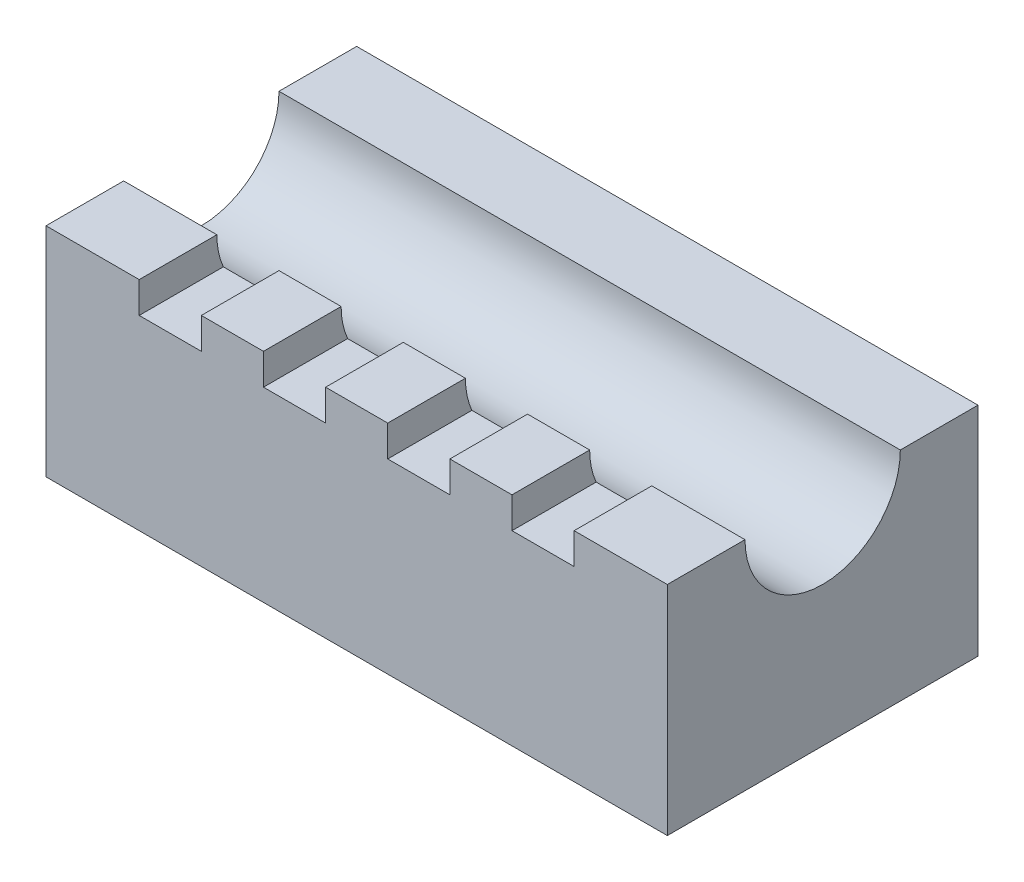
ISO-10303-21;
HEADER;
FILE_DESCRIPTION(('STEP AP214'),'2;1');
FILE_NAME('part.step','',(''),(''),'','','');
FILE_SCHEMA(('AUTOMOTIVE_DESIGN { 1 0 10303 214 1 1 1 1 }'));
ENDSEC;
DATA;
#1=APPLICATION_CONTEXT('core data for automotive mechanical design processes');
#2=APPLICATION_PROTOCOL_DEFINITION('international standard','automotive_design',2000,#1);
#3=PRODUCT_CONTEXT('',#1,'mechanical');
#4=PRODUCT('Part','Part','',(#3));
#5=PRODUCT_RELATED_PRODUCT_CATEGORY('part','',(#4));
#6=PRODUCT_DEFINITION_FORMATION('','',#4);
#7=PRODUCT_DEFINITION_CONTEXT('part definition',#1,'design');
#8=PRODUCT_DEFINITION('design','',#6,#7);
#9=PRODUCT_DEFINITION_SHAPE('','',#8);
#10=(LENGTH_UNIT() NAMED_UNIT(*) SI_UNIT(.MILLI.,.METRE.));
#11=(NAMED_UNIT(*) PLANE_ANGLE_UNIT() SI_UNIT($,.RADIAN.));
#12=(NAMED_UNIT(*) SI_UNIT($,.STERADIAN.) SOLID_ANGLE_UNIT());
#13=UNCERTAINTY_MEASURE_WITH_UNIT(LENGTH_MEASURE(1.E-05),#10,'distance_accuracy_value','');
#14=(GEOMETRIC_REPRESENTATION_CONTEXT(3) GLOBAL_UNCERTAINTY_ASSIGNED_CONTEXT((#13)) GLOBAL_UNIT_ASSIGNED_CONTEXT((#10,
#11,#12)) REPRESENTATION_CONTEXT('',''));
#15=CARTESIAN_POINT('',(0.,0.,0.));
#16=DIRECTION('',(0.,0.,1.));
#17=DIRECTION('',(1.,0.,0.));
#18=AXIS2_PLACEMENT_3D('',#15,#16,#17);
#19=CARTESIAN_POINT('',(0.,35.,0.));
#20=DIRECTION('',(0.,0.,-1.));
#21=DIRECTION('',(-1.,0.,0.));
#22=AXIS2_PLACEMENT_3D('',#19,#20,#21);
#23=PLANE('',#22);
#24=DIRECTION('',(0.,-1.,0.));
#25=VECTOR('',#24,1.);
#26=CARTESIAN_POINT('',(25.,0.,0.));
#27=LINE('',#26,#25);
#28=CARTESIAN_POINT('',(25.,35.,0.));
#29=VERTEX_POINT('',#28);
#30=CARTESIAN_POINT('',(25.,30.,0.));
#31=VERTEX_POINT('',#30);
#32=EDGE_CURVE('E187',#29,#31,#27,.T.);
#33=ORIENTED_EDGE('',*,*,#32,.T.);
#34=DIRECTION('',(1.,0.,0.));
#35=VECTOR('',#34,1.);
#36=CARTESIAN_POINT('',(0.,30.,0.));
#37=LINE('',#36,#35);
#38=CARTESIAN_POINT('',(15.,30.,0.));
#39=VERTEX_POINT('',#38);
#40=EDGE_CURVE('E212',#39,#31,#37,.T.);
#41=ORIENTED_EDGE('',*,*,#40,.F.);
#42=DIRECTION('',(0.,-1.,0.));
#43=VECTOR('',#42,1.);
#44=CARTESIAN_POINT('',(15.,0.,0.));
#45=LINE('',#44,#43);
#46=CARTESIAN_POINT('',(15.,35.,0.));
#47=VERTEX_POINT('',#46);
#48=EDGE_CURVE('E199',#47,#39,#45,.T.);
#49=ORIENTED_EDGE('',*,*,#48,.F.);
#50=DIRECTION('',(1.,0.,0.));
#51=VECTOR('',#50,1.);
#52=CARTESIAN_POINT('',(0.,35.,0.));
#53=LINE('',#52,#51);
#54=CARTESIAN_POINT('',(0.,35.,0.));
#55=VERTEX_POINT('',#54);
#56=EDGE_CURVE('E218',#55,#47,#53,.T.);
#57=ORIENTED_EDGE('',*,*,#56,.F.);
#58=DIRECTION('',(0.,-1.,0.));
#59=VECTOR('',#58,1.);
#60=CARTESIAN_POINT('',(0.,35.,0.));
#61=LINE('',#60,#59);
#62=CARTESIAN_POINT('',(0.,0.,0.));
#63=VERTEX_POINT('',#62);
#64=EDGE_CURVE('E266',#55,#63,#61,.T.);
#65=ORIENTED_EDGE('',*,*,#64,.T.);
#66=DIRECTION('',(1.,0.,0.));
#67=VECTOR('',#66,1.);
#68=CARTESIAN_POINT('',(0.,0.,0.));
#69=LINE('',#68,#67);
#70=CARTESIAN_POINT('',(100.,0.,0.));
#71=VERTEX_POINT('',#70);
#72=EDGE_CURVE('E244',#63,#71,#69,.T.);
#73=ORIENTED_EDGE('',*,*,#72,.T.);
#74=DIRECTION('',(0.,-1.,0.));
#75=VECTOR('',#74,1.);
#76=CARTESIAN_POINT('',(100.,35.,0.));
#77=LINE('',#76,#75);
#78=CARTESIAN_POINT('',(100.,35.,0.));
#79=VERTEX_POINT('',#78);
#80=EDGE_CURVE('E262',#79,#71,#77,.T.);
#81=ORIENTED_EDGE('',*,*,#80,.F.);
#82=CARTESIAN_POINT('',(85.,35.,0.));
#83=VERTEX_POINT('',#82);
#84=EDGE_CURVE('E225',#83,#79,#53,.T.);
#85=ORIENTED_EDGE('',*,*,#84,.F.);
#86=DIRECTION('',(0.,-1.,0.));
#87=VECTOR('',#86,1.);
#88=CARTESIAN_POINT('',(85.,0.,0.));
#89=LINE('',#88,#87);
#90=CARTESIAN_POINT('',(85.,30.,0.));
#91=VERTEX_POINT('',#90);
#92=EDGE_CURVE('E381',#83,#91,#89,.T.);
#93=ORIENTED_EDGE('',*,*,#92,.T.);
#94=DIRECTION('',(1.,0.,0.));
#95=VECTOR('',#94,1.);
#96=CARTESIAN_POINT('',(0.,30.,0.));
#97=LINE('',#96,#95);
#98=CARTESIAN_POINT('',(75.,30.,0.));
#99=VERTEX_POINT('',#98);
#100=EDGE_CURVE('E389',#99,#91,#97,.T.);
#101=ORIENTED_EDGE('',*,*,#100,.F.);
#102=DIRECTION('',(0.,-1.,0.));
#103=VECTOR('',#102,1.);
#104=CARTESIAN_POINT('',(75.,0.,0.));
#105=LINE('',#104,#103);
#106=CARTESIAN_POINT('',(75.,35.,0.));
#107=VERTEX_POINT('',#106);
#108=EDGE_CURVE('E385',#107,#99,#105,.T.);
#109=ORIENTED_EDGE('',*,*,#108,.F.);
#110=CARTESIAN_POINT('',(65.,35.,0.));
#111=VERTEX_POINT('',#110);
#112=EDGE_CURVE('E227',#111,#107,#53,.T.);
#113=ORIENTED_EDGE('',*,*,#112,.F.);
#114=DIRECTION('',(0.,-1.,0.));
#115=VECTOR('',#114,1.);
#116=CARTESIAN_POINT('',(65.,0.,0.));
#117=LINE('',#116,#115);
#118=CARTESIAN_POINT('',(65.,30.,0.));
#119=VERTEX_POINT('',#118);
#120=EDGE_CURVE('E356',#111,#119,#117,.T.);
#121=ORIENTED_EDGE('',*,*,#120,.T.);
#122=DIRECTION('',(1.,0.,0.));
#123=VECTOR('',#122,1.);
#124=CARTESIAN_POINT('',(0.,30.,0.));
#125=LINE('',#124,#123);
#126=CARTESIAN_POINT('',(55.,30.,0.));
#127=VERTEX_POINT('',#126);
#128=EDGE_CURVE('E365',#127,#119,#125,.T.);
#129=ORIENTED_EDGE('',*,*,#128,.F.);
#130=DIRECTION('',(0.,-1.,0.));
#131=VECTOR('',#130,1.);
#132=CARTESIAN_POINT('',(55.,0.,0.));
#133=LINE('',#132,#131);
#134=CARTESIAN_POINT('',(55.,35.,0.));
#135=VERTEX_POINT('',#134);
#136=EDGE_CURVE('E360',#135,#127,#133,.T.);
#137=ORIENTED_EDGE('',*,*,#136,.F.);
#138=CARTESIAN_POINT('',(45.,35.,0.));
#139=VERTEX_POINT('',#138);
#140=EDGE_CURVE('E219',#139,#135,#53,.T.);
#141=ORIENTED_EDGE('',*,*,#140,.F.);
#142=DIRECTION('',(0.,-1.,0.));
#143=VECTOR('',#142,1.);
#144=CARTESIAN_POINT('',(45.,0.,0.));
#145=LINE('',#144,#143);
#146=CARTESIAN_POINT('',(45.,30.,0.));
#147=VERTEX_POINT('',#146);
#148=EDGE_CURVE('E334',#139,#147,#145,.T.);
#149=ORIENTED_EDGE('',*,*,#148,.T.);
#150=DIRECTION('',(1.,0.,0.));
#151=VECTOR('',#150,1.);
#152=CARTESIAN_POINT('',(0.,30.,0.));
#153=LINE('',#152,#151);
#154=CARTESIAN_POINT('',(35.,30.,0.));
#155=VERTEX_POINT('',#154);
#156=EDGE_CURVE('E341',#155,#147,#153,.T.);
#157=ORIENTED_EDGE('',*,*,#156,.F.);
#158=DIRECTION('',(0.,-1.,0.));
#159=VECTOR('',#158,1.);
#160=CARTESIAN_POINT('',(35.,0.,0.));
#161=LINE('',#160,#159);
#162=CARTESIAN_POINT('',(35.,35.,0.));
#163=VERTEX_POINT('',#162);
#164=EDGE_CURVE('E216',#163,#155,#161,.T.);
#165=ORIENTED_EDGE('',*,*,#164,.F.);
#166=EDGE_CURVE('E207',#29,#163,#53,.T.);
#167=ORIENTED_EDGE('',*,*,#166,.F.);
#168=EDGE_LOOP('',(#33,#41,#49,#57,#65,#73,#81,#85,#93,#101,#109,#113,#121,#129,#137,#141,#149,
#157,#165,#167));
#169=FACE_BOUND('',#168,.T.);
#170=ADVANCED_FACE('F39',(#169),#23,.F.);
#171=CARTESIAN_POINT('',(0.,35.,0.));
#172=DIRECTION('',(0.,-1.,0.));
#173=DIRECTION('',(0.,0.,-1.));
#174=AXIS2_PLACEMENT_3D('',#171,#172,#173);
#175=PLANE('',#174);
#176=DIRECTION('',(0.,0.,1.));
#177=VECTOR('',#176,1.);
#178=CARTESIAN_POINT('',(25.,35.,-25.));
#179=LINE('',#178,#177);
#180=CARTESIAN_POINT('',(25.,35.,-12.5));
#181=VERTEX_POINT('',#180);
#182=EDGE_CURVE('E190',#181,#29,#179,.T.);
#183=ORIENTED_EDGE('',*,*,#182,.T.);
#184=ORIENTED_EDGE('',*,*,#166,.T.);
#185=DIRECTION('',(0.,0.,1.));
#186=VECTOR('',#185,1.);
#187=CARTESIAN_POINT('',(35.,35.,-25.));
#188=LINE('',#187,#186);
#189=CARTESIAN_POINT('',(35.,35.,-12.5));
#190=VERTEX_POINT('',#189);
#191=EDGE_CURVE('E350',#190,#163,#188,.T.);
#192=ORIENTED_EDGE('',*,*,#191,.F.);
#193=DIRECTION('',(1.,0.,0.));
#194=VECTOR('',#193,1.);
#195=CARTESIAN_POINT('',(0.,35.,-12.5));
#196=LINE('',#195,#194);
#197=EDGE_CURVE('E209',#190,#181,#196,.F.);
#198=ORIENTED_EDGE('',*,*,#197,.T.);
#199=EDGE_LOOP('',(#183,#184,#192,#198));
#200=FACE_BOUND('',#199,.T.);
#201=ADVANCED_FACE('F205',(#200),#175,.F.);
#202=DIRECTION('',(0.,0.,1.));
#203=VECTOR('',#202,1.);
#204=CARTESIAN_POINT('',(45.,35.,-25.));
#205=LINE('',#204,#203);
#206=CARTESIAN_POINT('',(45.,35.,-12.5));
#207=VERTEX_POINT('',#206);
#208=EDGE_CURVE('E345',#207,#139,#205,.T.);
#209=ORIENTED_EDGE('',*,*,#208,.T.);
#210=ORIENTED_EDGE('',*,*,#140,.T.);
#211=DIRECTION('',(0.,0.,1.));
#212=VECTOR('',#211,1.);
#213=CARTESIAN_POINT('',(55.,35.,-25.));
#214=LINE('',#213,#212);
#215=CARTESIAN_POINT('',(55.,35.,-12.5));
#216=VERTEX_POINT('',#215);
#217=EDGE_CURVE('E375',#216,#135,#214,.T.);
#218=ORIENTED_EDGE('',*,*,#217,.F.);
#219=EDGE_CURVE('E475',#216,#207,#196,.F.);
#220=ORIENTED_EDGE('',*,*,#219,.T.);
#221=EDGE_LOOP('',(#209,#210,#218,#220));
#222=FACE_BOUND('',#221,.T.);
#223=ADVANCED_FACE('F473',(#222),#175,.F.);
#224=DIRECTION('',(0.,0.,1.));
#225=VECTOR('',#224,1.);
#226=CARTESIAN_POINT('',(65.,35.,-25.));
#227=LINE('',#226,#225);
#228=CARTESIAN_POINT('',(65.,35.,-12.5));
#229=VERTEX_POINT('',#228);
#230=EDGE_CURVE('E369',#229,#111,#227,.T.);
#231=ORIENTED_EDGE('',*,*,#230,.T.);
#232=ORIENTED_EDGE('',*,*,#112,.T.);
#233=DIRECTION('',(0.,0.,1.));
#234=VECTOR('',#233,1.);
#235=CARTESIAN_POINT('',(75.,35.,-25.));
#236=LINE('',#235,#234);
#237=CARTESIAN_POINT('',(75.,35.,-12.5));
#238=VERTEX_POINT('',#237);
#239=EDGE_CURVE('E399',#238,#107,#236,.T.);
#240=ORIENTED_EDGE('',*,*,#239,.F.);
#241=EDGE_CURVE('E276',#238,#229,#196,.F.);
#242=ORIENTED_EDGE('',*,*,#241,.T.);
#243=EDGE_LOOP('',(#231,#232,#240,#242));
#244=FACE_BOUND('',#243,.T.);
#245=ADVANCED_FACE('F455',(#244),#175,.F.);
#246=DIRECTION('',(0.,0.,1.));
#247=VECTOR('',#246,1.);
#248=CARTESIAN_POINT('',(85.,35.,-25.));
#249=LINE('',#248,#247);
#250=CARTESIAN_POINT('',(85.,35.,-12.5));
#251=VERTEX_POINT('',#250);
#252=EDGE_CURVE('E393',#251,#83,#249,.T.);
#253=ORIENTED_EDGE('',*,*,#252,.T.);
#254=ORIENTED_EDGE('',*,*,#84,.T.);
#255=DIRECTION('',(0.,0.,-1.));
#256=VECTOR('',#255,1.);
#257=CARTESIAN_POINT('',(100.,35.,0.));
#258=LINE('',#257,#256);
#259=CARTESIAN_POINT('',(100.,35.,-12.5));
#260=VERTEX_POINT('',#259);
#261=EDGE_CURVE('E232',#79,#260,#258,.T.);
#262=ORIENTED_EDGE('',*,*,#261,.T.);
#263=EDGE_CURVE('E271',#260,#251,#196,.F.);
#264=ORIENTED_EDGE('',*,*,#263,.T.);
#265=EDGE_LOOP('',(#253,#254,#262,#264));
#266=FACE_BOUND('',#265,.T.);
#267=ADVANCED_FACE('F439',(#266),#175,.F.);
#268=CARTESIAN_POINT('',(0.,35.,-25.));
#269=DIRECTION('',(1.,0.,0.));
#270=DIRECTION('',(0.,0.,-1.));
#271=AXIS2_PLACEMENT_3D('',#268,#269,#270);
#272=CYLINDRICAL_SURFACE('',#271,12.5);
#273=CARTESIAN_POINT('',(25.,35.,-25.));
#274=DIRECTION('',(-1.,0.,0.));
#275=DIRECTION('',(0.,0.,1.));
#276=AXIS2_PLACEMENT_3D('',#273,#274,#275);
#277=CIRCLE('',#276,12.5);
#278=CARTESIAN_POINT('',(25.,30.,-13.5435607626104));
#279=VERTEX_POINT('',#278);
#280=EDGE_CURVE('E11',#181,#279,#277,.F.);
#281=ORIENTED_EDGE('',*,*,#280,.F.);
#282=ORIENTED_EDGE('',*,*,#197,.F.);
#283=CARTESIAN_POINT('',(35.,35.,-25.));
#284=DIRECTION('',(-1.,0.,0.));
#285=DIRECTION('',(0.,0.,1.));
#286=AXIS2_PLACEMENT_3D('',#283,#284,#285);
#287=CIRCLE('',#286,12.5);
#288=CARTESIAN_POINT('',(35.,30.,-13.5435607626104));
#289=VERTEX_POINT('',#288);
#290=EDGE_CURVE('E302',#190,#289,#287,.F.);
#291=ORIENTED_EDGE('',*,*,#290,.T.);
#292=DIRECTION('',(1.,0.,0.));
#293=VECTOR('',#292,1.);
#294=CARTESIAN_POINT('',(0.,30.,-13.5435607626104));
#295=LINE('',#294,#293);
#296=CARTESIAN_POINT('',(45.,30.,-13.5435607626104));
#297=VERTEX_POINT('',#296);
#298=EDGE_CURVE('E306',#289,#297,#295,.T.);
#299=ORIENTED_EDGE('',*,*,#298,.T.);
#300=CARTESIAN_POINT('',(45.,35.,-25.));
#301=DIRECTION('',(-1.,0.,0.));
#302=DIRECTION('',(0.,0.,1.));
#303=AXIS2_PLACEMENT_3D('',#300,#301,#302);
#304=CIRCLE('',#303,12.5);
#305=EDGE_CURVE('E310',#207,#297,#304,.F.);
#306=ORIENTED_EDGE('',*,*,#305,.F.);
#307=ORIENTED_EDGE('',*,*,#219,.F.);
#308=CARTESIAN_POINT('',(55.,35.,-25.));
#309=DIRECTION('',(-1.,0.,0.));
#310=DIRECTION('',(0.,0.,1.));
#311=AXIS2_PLACEMENT_3D('',#308,#309,#310);
#312=CIRCLE('',#311,12.5);
#313=CARTESIAN_POINT('',(55.,30.,-13.5435607626104));
#314=VERTEX_POINT('',#313);
#315=EDGE_CURVE('E291',#216,#314,#312,.F.);
#316=ORIENTED_EDGE('',*,*,#315,.T.);
#317=DIRECTION('',(1.,0.,0.));
#318=VECTOR('',#317,1.);
#319=CARTESIAN_POINT('',(0.,30.,-13.5435607626104));
#320=LINE('',#319,#318);
#321=CARTESIAN_POINT('',(65.,30.,-13.5435607626104));
#322=VERTEX_POINT('',#321);
#323=EDGE_CURVE('E295',#314,#322,#320,.T.);
#324=ORIENTED_EDGE('',*,*,#323,.T.);
#325=CARTESIAN_POINT('',(65.,35.,-25.));
#326=DIRECTION('',(-1.,0.,0.));
#327=DIRECTION('',(0.,0.,1.));
#328=AXIS2_PLACEMENT_3D('',#325,#326,#327);
#329=CIRCLE('',#328,12.5);
#330=EDGE_CURVE('E299',#229,#322,#329,.F.);
#331=ORIENTED_EDGE('',*,*,#330,.F.);
#332=ORIENTED_EDGE('',*,*,#241,.F.);
#333=CARTESIAN_POINT('',(75.,35.,-25.));
#334=DIRECTION('',(-1.,0.,0.));
#335=DIRECTION('',(0.,0.,1.));
#336=AXIS2_PLACEMENT_3D('',#333,#334,#335);
#337=CIRCLE('',#336,12.5);
#338=CARTESIAN_POINT('',(75.,30.,-13.5435607626104));
#339=VERTEX_POINT('',#338);
#340=EDGE_CURVE('E280',#238,#339,#337,.F.);
#341=ORIENTED_EDGE('',*,*,#340,.T.);
#342=DIRECTION('',(1.,0.,0.));
#343=VECTOR('',#342,1.);
#344=CARTESIAN_POINT('',(0.,30.,-13.5435607626104));
#345=LINE('',#344,#343);
#346=CARTESIAN_POINT('',(85.,30.,-13.5435607626104));
#347=VERTEX_POINT('',#346);
#348=EDGE_CURVE('E284',#339,#347,#345,.T.);
#349=ORIENTED_EDGE('',*,*,#348,.T.);
#350=CARTESIAN_POINT('',(85.,35.,-25.));
#351=DIRECTION('',(-1.,0.,0.));
#352=DIRECTION('',(0.,0.,1.));
#353=AXIS2_PLACEMENT_3D('',#350,#351,#352);
#354=CIRCLE('',#353,12.5);
#355=EDGE_CURVE('E288',#251,#347,#354,.F.);
#356=ORIENTED_EDGE('',*,*,#355,.F.);
#357=ORIENTED_EDGE('',*,*,#263,.F.);
#358=CARTESIAN_POINT('',(100.,35.,-25.));
#359=DIRECTION('',(1.,0.,0.));
#360=DIRECTION('',(0.,0.,-1.));
#361=AXIS2_PLACEMENT_3D('',#358,#359,#360);
#362=CIRCLE('',#361,12.5);
#363=CARTESIAN_POINT('',(100.,35.,-37.5));
#364=VERTEX_POINT('',#363);
#365=EDGE_CURVE('E324',#260,#364,#362,.T.);
#366=ORIENTED_EDGE('',*,*,#365,.T.);
#367=DIRECTION('',(1.,0.,0.));
#368=VECTOR('',#367,1.);
#369=CARTESIAN_POINT('',(0.,35.,-37.5));
#370=LINE('',#369,#368);
#371=CARTESIAN_POINT('',(0.,35.,-37.5));
#372=VERTEX_POINT('',#371);
#373=EDGE_CURVE('E275',#372,#364,#370,.T.);
#374=ORIENTED_EDGE('',*,*,#373,.F.);
#375=CARTESIAN_POINT('',(0.,35.,-25.));
#376=DIRECTION('',(1.,0.,0.));
#377=DIRECTION('',(0.,0.,-1.));
#378=AXIS2_PLACEMENT_3D('',#375,#376,#377);
#379=CIRCLE('',#378,12.5);
#380=CARTESIAN_POINT('',(0.,35.,-12.5));
#381=VERTEX_POINT('',#380);
#382=EDGE_CURVE('E245',#381,#372,#379,.T.);
#383=ORIENTED_EDGE('',*,*,#382,.F.);
#384=CARTESIAN_POINT('',(15.,35.,-12.5));
#385=VERTEX_POINT('',#384);
#386=EDGE_CURVE('E270',#385,#381,#196,.F.);
#387=ORIENTED_EDGE('',*,*,#386,.F.);
#388=CARTESIAN_POINT('',(15.,35.,-25.));
#389=DIRECTION('',(-1.,0.,0.));
#390=DIRECTION('',(0.,0.,1.));
#391=AXIS2_PLACEMENT_3D('',#388,#389,#390);
#392=CIRCLE('',#391,12.5);
#393=CARTESIAN_POINT('',(15.,30.,-13.5435607626104));
#394=VERTEX_POINT('',#393);
#395=EDGE_CURVE('E313',#385,#394,#392,.F.);
#396=ORIENTED_EDGE('',*,*,#395,.T.);
#397=DIRECTION('',(1.,0.,0.));
#398=VECTOR('',#397,1.);
#399=CARTESIAN_POINT('',(0.,30.,-13.5435607626104));
#400=LINE('',#399,#398);
#401=EDGE_CURVE('E48',#394,#279,#400,.T.);
#402=ORIENTED_EDGE('',*,*,#401,.T.);
#403=EDGE_LOOP('',(#281,#282,#291,#299,#306,#307,#316,#324,#331,#332,#341,#349,#356,#357,#366,
#374,#383,#387,#396,#402));
#404=FACE_BOUND('',#403,.T.);
#405=ADVANCED_FACE('F319',(#404),#272,.F.);
#406=DIRECTION('',(0.,0.,1.));
#407=VECTOR('',#406,1.);
#408=CARTESIAN_POINT('',(0.,35.,0.));
#409=LINE('',#408,#407);
#410=CARTESIAN_POINT('',(0.,35.,-50.));
#411=VERTEX_POINT('',#410);
#412=EDGE_CURVE('E230',#411,#372,#409,.T.);
#413=ORIENTED_EDGE('',*,*,#412,.T.);
#414=ORIENTED_EDGE('',*,*,#373,.T.);
#415=CARTESIAN_POINT('',(100.,35.,-50.));
#416=VERTEX_POINT('',#415);
#417=EDGE_CURVE('E224',#364,#416,#258,.T.);
#418=ORIENTED_EDGE('',*,*,#417,.T.);
#419=DIRECTION('',(-1.,0.,0.));
#420=VECTOR('',#419,1.);
#421=CARTESIAN_POINT('',(0.,35.,-50.));
#422=LINE('',#421,#420);
#423=EDGE_CURVE('E236',#416,#411,#422,.T.);
#424=ORIENTED_EDGE('',*,*,#423,.T.);
#425=EDGE_LOOP('',(#413,#414,#418,#424));
#426=FACE_BOUND('',#425,.T.);
#427=ADVANCED_FACE('F414',(#426),#175,.F.);
#428=CARTESIAN_POINT('',(0.,35.,0.));
#429=DIRECTION('',(1.,0.,0.));
#430=DIRECTION('',(0.,0.,-1.));
#431=AXIS2_PLACEMENT_3D('',#428,#429,#430);
#432=PLANE('',#431);
#433=EDGE_CURVE('E254',#381,#55,#409,.T.);
#434=ORIENTED_EDGE('',*,*,#433,.F.);
#435=ORIENTED_EDGE('',*,*,#382,.T.);
#436=ORIENTED_EDGE('',*,*,#412,.F.);
#437=DIRECTION('',(0.,-1.,0.));
#438=VECTOR('',#437,1.);
#439=CARTESIAN_POINT('',(0.,35.,-50.));
#440=LINE('',#439,#438);
#441=CARTESIAN_POINT('',(0.,0.,-50.));
#442=VERTEX_POINT('',#441);
#443=EDGE_CURVE('E239',#411,#442,#440,.T.);
#444=ORIENTED_EDGE('',*,*,#443,.T.);
#445=DIRECTION('',(0.,0.,1.));
#446=VECTOR('',#445,1.);
#447=CARTESIAN_POINT('',(0.,0.,0.));
#448=LINE('',#447,#446);
#449=EDGE_CURVE('E240',#442,#63,#448,.T.);
#450=ORIENTED_EDGE('',*,*,#449,.T.);
#451=ORIENTED_EDGE('',*,*,#64,.F.);
#452=EDGE_LOOP('',(#434,#435,#436,#444,#450,#451));
#453=FACE_BOUND('',#452,.T.);
#454=ADVANCED_FACE('F41',(#453),#432,.F.);
#455=CARTESIAN_POINT('',(100.,35.,0.));
#456=DIRECTION('',(-1.,0.,0.));
#457=DIRECTION('',(0.,0.,1.));
#458=AXIS2_PLACEMENT_3D('',#455,#456,#457);
#459=PLANE('',#458);
#460=ORIENTED_EDGE('',*,*,#417,.F.);
#461=ORIENTED_EDGE('',*,*,#365,.F.);
#462=ORIENTED_EDGE('',*,*,#261,.F.);
#463=ORIENTED_EDGE('',*,*,#80,.T.);
#464=DIRECTION('',(0.,0.,-1.));
#465=VECTOR('',#464,1.);
#466=CARTESIAN_POINT('',(100.,0.,0.));
#467=LINE('',#466,#465);
#468=CARTESIAN_POINT('',(100.,0.,-50.));
#469=VERTEX_POINT('',#468);
#470=EDGE_CURVE('E248',#71,#469,#467,.T.);
#471=ORIENTED_EDGE('',*,*,#470,.T.);
#472=DIRECTION('',(0.,-1.,0.));
#473=VECTOR('',#472,1.);
#474=CARTESIAN_POINT('',(100.,35.,-50.));
#475=LINE('',#474,#473);
#476=EDGE_CURVE('E258',#416,#469,#475,.T.);
#477=ORIENTED_EDGE('',*,*,#476,.F.);
#478=EDGE_LOOP('',(#460,#461,#462,#463,#471,#477));
#479=FACE_BOUND('',#478,.T.);
#480=ADVANCED_FACE('F435',(#479),#459,.F.);
#481=CARTESIAN_POINT('',(0.,35.,-50.));
#482=DIRECTION('',(0.,0.,1.));
#483=DIRECTION('',(1.,0.,0.));
#484=AXIS2_PLACEMENT_3D('',#481,#482,#483);
#485=PLANE('',#484);
#486=DIRECTION('',(-1.,0.,0.));
#487=VECTOR('',#486,1.);
#488=CARTESIAN_POINT('',(0.,0.,-50.));
#489=LINE('',#488,#487);
#490=EDGE_CURVE('E251',#469,#442,#489,.T.);
#491=ORIENTED_EDGE('',*,*,#490,.T.);
#492=ORIENTED_EDGE('',*,*,#443,.F.);
#493=ORIENTED_EDGE('',*,*,#423,.F.);
#494=ORIENTED_EDGE('',*,*,#476,.T.);
#495=EDGE_LOOP('',(#491,#492,#493,#494));
#496=FACE_BOUND('',#495,.T.);
#497=ADVANCED_FACE('F488',(#496),#485,.F.);
#498=ORIENTED_EDGE('',*,*,#56,.T.);
#499=DIRECTION('',(0.,0.,1.));
#500=VECTOR('',#499,1.);
#501=CARTESIAN_POINT('',(15.,35.,-25.));
#502=LINE('',#501,#500);
#503=EDGE_CURVE('E211',#385,#47,#502,.T.);
#504=ORIENTED_EDGE('',*,*,#503,.F.);
#505=ORIENTED_EDGE('',*,*,#386,.T.);
#506=ORIENTED_EDGE('',*,*,#433,.T.);
#507=EDGE_LOOP('',(#498,#504,#505,#506));
#508=FACE_BOUND('',#507,.T.);
#509=ADVANCED_FACE('F423',(#508),#175,.F.);
#510=CARTESIAN_POINT('',(0.,0.,0.));
#511=DIRECTION('',(0.,-1.,0.));
#512=DIRECTION('',(0.,0.,-1.));
#513=AXIS2_PLACEMENT_3D('',#510,#511,#512);
#514=PLANE('',#513);
#515=ORIENTED_EDGE('',*,*,#449,.F.);
#516=ORIENTED_EDGE('',*,*,#490,.F.);
#517=ORIENTED_EDGE('',*,*,#470,.F.);
#518=ORIENTED_EDGE('',*,*,#72,.F.);
#519=EDGE_LOOP('',(#515,#516,#517,#518));
#520=FACE_BOUND('',#519,.T.);
#521=ADVANCED_FACE('F429',(#520),#514,.T.);
#522=CARTESIAN_POINT('',(85.,0.,-25.));
#523=DIRECTION('',(-1.,0.,0.));
#524=DIRECTION('',(0.,0.,1.));
#525=AXIS2_PLACEMENT_3D('',#522,#523,#524);
#526=PLANE('',#525);
#527=ORIENTED_EDGE('',*,*,#355,.T.);
#528=DIRECTION('',(0.,0.,1.));
#529=VECTOR('',#528,1.);
#530=CARTESIAN_POINT('',(85.,30.,-25.));
#531=LINE('',#530,#529);
#532=EDGE_CURVE('E361',#347,#91,#531,.T.);
#533=ORIENTED_EDGE('',*,*,#532,.T.);
#534=ORIENTED_EDGE('',*,*,#92,.F.);
#535=ORIENTED_EDGE('',*,*,#252,.F.);
#536=EDGE_LOOP('',(#527,#533,#534,#535));
#537=FACE_BOUND('',#536,.T.);
#538=ADVANCED_FACE('F443',(#537),#526,.T.);
#539=CARTESIAN_POINT('',(0.,30.,-25.));
#540=DIRECTION('',(0.,-1.,0.));
#541=DIRECTION('',(1.,0.,0.));
#542=AXIS2_PLACEMENT_3D('',#539,#540,#541);
#543=PLANE('',#542);
#544=DIRECTION('',(0.,0.,1.));
#545=VECTOR('',#544,1.);
#546=CARTESIAN_POINT('',(75.,30.,-25.));
#547=LINE('',#546,#545);
#548=EDGE_CURVE('E396',#339,#99,#547,.T.);
#549=ORIENTED_EDGE('',*,*,#548,.T.);
#550=ORIENTED_EDGE('',*,*,#100,.T.);
#551=ORIENTED_EDGE('',*,*,#532,.F.);
#552=ORIENTED_EDGE('',*,*,#348,.F.);
#553=EDGE_LOOP('',(#549,#550,#551,#552));
#554=FACE_BOUND('',#553,.T.);
#555=ADVANCED_FACE('F448',(#554),#543,.F.);
#556=CARTESIAN_POINT('',(75.,0.,-25.));
#557=DIRECTION('',(-1.,0.,0.));
#558=DIRECTION('',(0.,0.,1.));
#559=AXIS2_PLACEMENT_3D('',#556,#557,#558);
#560=PLANE('',#559);
#561=ORIENTED_EDGE('',*,*,#239,.T.);
#562=ORIENTED_EDGE('',*,*,#108,.T.);
#563=ORIENTED_EDGE('',*,*,#548,.F.);
#564=ORIENTED_EDGE('',*,*,#340,.F.);
#565=EDGE_LOOP('',(#561,#562,#563,#564));
#566=FACE_BOUND('',#565,.T.);
#567=ADVANCED_FACE('F450',(#566),#560,.F.);
#568=CARTESIAN_POINT('',(65.,0.,-25.));
#569=DIRECTION('',(-1.,0.,0.));
#570=DIRECTION('',(0.,0.,1.));
#571=AXIS2_PLACEMENT_3D('',#568,#569,#570);
#572=PLANE('',#571);
#573=ORIENTED_EDGE('',*,*,#330,.T.);
#574=DIRECTION('',(0.,0.,1.));
#575=VECTOR('',#574,1.);
#576=CARTESIAN_POINT('',(65.,30.,-25.));
#577=LINE('',#576,#575);
#578=EDGE_CURVE('E338',#322,#119,#577,.T.);
#579=ORIENTED_EDGE('',*,*,#578,.T.);
#580=ORIENTED_EDGE('',*,*,#120,.F.);
#581=ORIENTED_EDGE('',*,*,#230,.F.);
#582=EDGE_LOOP('',(#573,#579,#580,#581));
#583=FACE_BOUND('',#582,.T.);
#584=ADVANCED_FACE('F461',(#583),#572,.T.);
#585=CARTESIAN_POINT('',(0.,30.,-25.));
#586=DIRECTION('',(0.,-1.,0.));
#587=DIRECTION('',(0.,0.,-1.));
#588=AXIS2_PLACEMENT_3D('',#585,#586,#587);
#589=PLANE('',#588);
#590=DIRECTION('',(0.,0.,1.));
#591=VECTOR('',#590,1.);
#592=CARTESIAN_POINT('',(55.,30.,-25.));
#593=LINE('',#592,#591);
#594=EDGE_CURVE('E372',#314,#127,#593,.T.);
#595=ORIENTED_EDGE('',*,*,#594,.T.);
#596=ORIENTED_EDGE('',*,*,#128,.T.);
#597=ORIENTED_EDGE('',*,*,#578,.F.);
#598=ORIENTED_EDGE('',*,*,#323,.F.);
#599=EDGE_LOOP('',(#595,#596,#597,#598));
#600=FACE_BOUND('',#599,.T.);
#601=ADVANCED_FACE('F466',(#600),#589,.F.);
#602=CARTESIAN_POINT('',(55.,0.,-25.));
#603=DIRECTION('',(-1.,0.,0.));
#604=DIRECTION('',(0.,0.,1.));
#605=AXIS2_PLACEMENT_3D('',#602,#603,#604);
#606=PLANE('',#605);
#607=ORIENTED_EDGE('',*,*,#217,.T.);
#608=ORIENTED_EDGE('',*,*,#136,.T.);
#609=ORIENTED_EDGE('',*,*,#594,.F.);
#610=ORIENTED_EDGE('',*,*,#315,.F.);
#611=EDGE_LOOP('',(#607,#608,#609,#610));
#612=FACE_BOUND('',#611,.T.);
#613=ADVANCED_FACE('F520',(#612),#606,.F.);
#614=CARTESIAN_POINT('',(45.,0.,-25.));
#615=DIRECTION('',(-1.,0.,0.));
#616=DIRECTION('',(0.,0.,1.));
#617=AXIS2_PLACEMENT_3D('',#614,#615,#616);
#618=PLANE('',#617);
#619=ORIENTED_EDGE('',*,*,#305,.T.);
#620=DIRECTION('',(0.,0.,1.));
#621=VECTOR('',#620,1.);
#622=CARTESIAN_POINT('',(45.,30.,-25.));
#623=LINE('',#622,#621);
#624=EDGE_CURVE('E200',#297,#147,#623,.T.);
#625=ORIENTED_EDGE('',*,*,#624,.T.);
#626=ORIENTED_EDGE('',*,*,#148,.F.);
#627=ORIENTED_EDGE('',*,*,#208,.F.);
#628=EDGE_LOOP('',(#619,#625,#626,#627));
#629=FACE_BOUND('',#628,.T.);
#630=ADVANCED_FACE('F478',(#629),#618,.T.);
#631=CARTESIAN_POINT('',(0.,30.,-25.));
#632=DIRECTION('',(0.,-1.,0.));
#633=DIRECTION('',(0.,0.,-1.));
#634=AXIS2_PLACEMENT_3D('',#631,#632,#633);
#635=PLANE('',#634);
#636=DIRECTION('',(0.,0.,1.));
#637=VECTOR('',#636,1.);
#638=CARTESIAN_POINT('',(35.,30.,-25.));
#639=LINE('',#638,#637);
#640=EDGE_CURVE('E63',#289,#155,#639,.T.);
#641=ORIENTED_EDGE('',*,*,#640,.T.);
#642=ORIENTED_EDGE('',*,*,#156,.T.);
#643=ORIENTED_EDGE('',*,*,#624,.F.);
#644=ORIENTED_EDGE('',*,*,#298,.F.);
#645=EDGE_LOOP('',(#641,#642,#643,#644));
#646=FACE_BOUND('',#645,.T.);
#647=ADVANCED_FACE('F481',(#646),#635,.F.);
#648=CARTESIAN_POINT('',(35.,0.,-25.));
#649=DIRECTION('',(-1.,0.,0.));
#650=DIRECTION('',(0.,0.,1.));
#651=AXIS2_PLACEMENT_3D('',#648,#649,#650);
#652=PLANE('',#651);
#653=ORIENTED_EDGE('',*,*,#191,.T.);
#654=ORIENTED_EDGE('',*,*,#164,.T.);
#655=ORIENTED_EDGE('',*,*,#640,.F.);
#656=ORIENTED_EDGE('',*,*,#290,.F.);
#657=EDGE_LOOP('',(#653,#654,#655,#656));
#658=FACE_BOUND('',#657,.T.);
#659=ADVANCED_FACE('F482',(#658),#652,.F.);
#660=CARTESIAN_POINT('',(25.,0.,-25.));
#661=DIRECTION('',(-1.,0.,0.));
#662=DIRECTION('',(0.,0.,1.));
#663=AXIS2_PLACEMENT_3D('',#660,#661,#662);
#664=PLANE('',#663);
#665=ORIENTED_EDGE('',*,*,#280,.T.);
#666=DIRECTION('',(0.,0.,1.));
#667=VECTOR('',#666,1.);
#668=CARTESIAN_POINT('',(25.,30.,-25.));
#669=LINE('',#668,#667);
#670=EDGE_CURVE('E193',#279,#31,#669,.T.);
#671=ORIENTED_EDGE('',*,*,#670,.T.);
#672=ORIENTED_EDGE('',*,*,#32,.F.);
#673=ORIENTED_EDGE('',*,*,#182,.F.);
#674=EDGE_LOOP('',(#665,#671,#672,#673));
#675=FACE_BOUND('',#674,.T.);
#676=ADVANCED_FACE('F189',(#675),#664,.T.);
#677=CARTESIAN_POINT('',(0.,30.,-25.));
#678=DIRECTION('',(0.,-1.,0.));
#679=DIRECTION('',(1.,0.,0.));
#680=AXIS2_PLACEMENT_3D('',#677,#678,#679);
#681=PLANE('',#680);
#682=DIRECTION('',(0.,0.,1.));
#683=VECTOR('',#682,1.);
#684=CARTESIAN_POINT('',(15.,30.,-25.));
#685=LINE('',#684,#683);
#686=EDGE_CURVE('E55',#394,#39,#685,.T.);
#687=ORIENTED_EDGE('',*,*,#686,.T.);
#688=ORIENTED_EDGE('',*,*,#40,.T.);
#689=ORIENTED_EDGE('',*,*,#670,.F.);
#690=ORIENTED_EDGE('',*,*,#401,.F.);
#691=EDGE_LOOP('',(#687,#688,#689,#690));
#692=FACE_BOUND('',#691,.T.);
#693=ADVANCED_FACE('F322',(#692),#681,.F.);
#694=CARTESIAN_POINT('',(15.,0.,-25.));
#695=DIRECTION('',(-1.,0.,0.));
#696=DIRECTION('',(0.,0.,1.));
#697=AXIS2_PLACEMENT_3D('',#694,#695,#696);
#698=PLANE('',#697);
#699=ORIENTED_EDGE('',*,*,#503,.T.);
#700=ORIENTED_EDGE('',*,*,#48,.T.);
#701=ORIENTED_EDGE('',*,*,#686,.F.);
#702=ORIENTED_EDGE('',*,*,#395,.F.);
#703=EDGE_LOOP('',(#699,#700,#701,#702));
#704=FACE_BOUND('',#703,.T.);
#705=ADVANCED_FACE('F533',(#704),#698,.F.);
#706=CLOSED_SHELL('',(#170,#201,#223,#245,#267,#405,#427,#454,#480,#497,#509,#521,#538,#555,
#567,#584,#601,#613,#630,#647,#659,#676,#693,#705));
#707=MANIFOLD_SOLID_BREP('B2',#706);
#708=ADVANCED_BREP_SHAPE_REPRESENTATION('',(#18,#707),#14);
#709=SHAPE_DEFINITION_REPRESENTATION(#9,#708);
ENDSEC;
END-ISO-10303-21;
